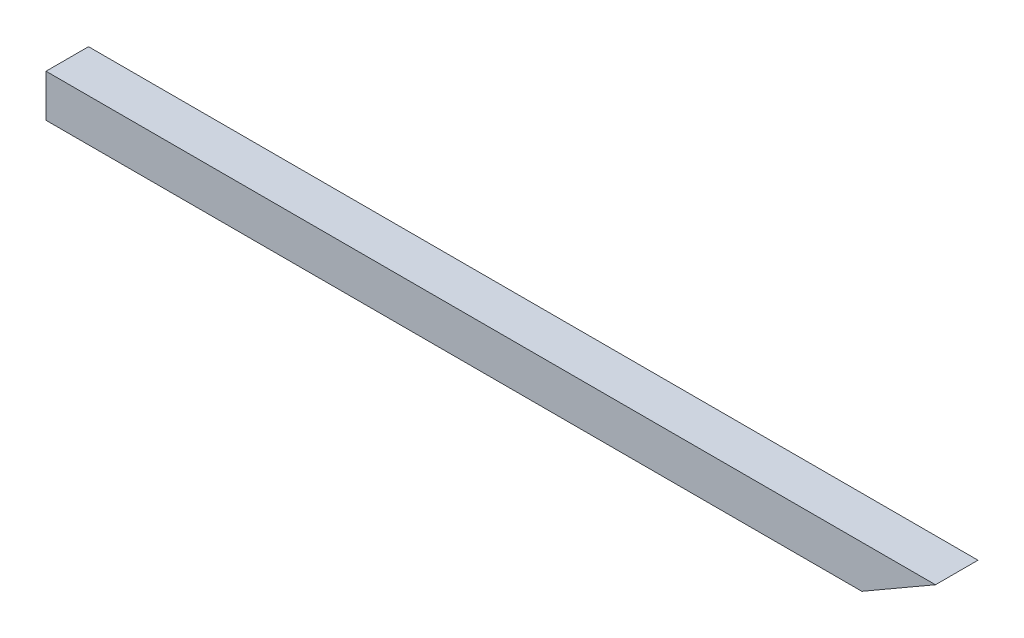
ISO-10303-21;
HEADER;
FILE_DESCRIPTION(('STEP AP214'),'2;1');
FILE_NAME('part.step','',(''),(''),'','','');
FILE_SCHEMA(('AUTOMOTIVE_DESIGN { 1 0 10303 214 1 1 1 1 }'));
ENDSEC;
DATA;
#1=APPLICATION_CONTEXT('core data for automotive mechanical design processes');
#2=APPLICATION_PROTOCOL_DEFINITION('international standard','automotive_design',2000,#1);
#3=PRODUCT_CONTEXT('',#1,'mechanical');
#4=PRODUCT('Part','Part','',(#3));
#5=PRODUCT_RELATED_PRODUCT_CATEGORY('part','',(#4));
#6=PRODUCT_DEFINITION_FORMATION('','',#4);
#7=PRODUCT_DEFINITION_CONTEXT('part definition',#1,'design');
#8=PRODUCT_DEFINITION('design','',#6,#7);
#9=PRODUCT_DEFINITION_SHAPE('','',#8);
#10=(LENGTH_UNIT() NAMED_UNIT(*) SI_UNIT(.MILLI.,.METRE.));
#11=(NAMED_UNIT(*) PLANE_ANGLE_UNIT() SI_UNIT($,.RADIAN.));
#12=(NAMED_UNIT(*) SI_UNIT($,.STERADIAN.) SOLID_ANGLE_UNIT());
#13=UNCERTAINTY_MEASURE_WITH_UNIT(LENGTH_MEASURE(1.E-05),#10,'distance_accuracy_value','');
#14=(GEOMETRIC_REPRESENTATION_CONTEXT(3) GLOBAL_UNCERTAINTY_ASSIGNED_CONTEXT((#13)) GLOBAL_UNIT_ASSIGNED_CONTEXT((#10,
#11,#12)) REPRESENTATION_CONTEXT('',''));
#15=CARTESIAN_POINT('',(0.,0.,0.));
#16=DIRECTION('',(0.,0.,1.));
#17=DIRECTION('',(1.,0.,0.));
#18=AXIS2_PLACEMENT_3D('',#15,#16,#17);
#19=CARTESIAN_POINT('',(-37.8688524590164,9.75409836065574,20.));
#20=DIRECTION('',(1.,0.,0.));
#21=DIRECTION('',(0.,1.,0.));
#22=AXIS2_PLACEMENT_3D('',#19,#20,#21);
#23=PLANE('',#22);
#24=DIRECTION('',(0.,-1.,0.));
#25=VECTOR('',#24,1.);
#26=CARTESIAN_POINT('',(-37.8688524590164,9.75409836065574,0.));
#27=LINE('',#26,#25);
#28=CARTESIAN_POINT('',(-37.8688524590164,9.75409836065574,0.));
#29=VERTEX_POINT('',#28);
#30=CARTESIAN_POINT('',(-37.8688524590165,-10.2459016393443,0.));
#31=VERTEX_POINT('',#30);
#32=EDGE_CURVE('E96',#29,#31,#27,.T.);
#33=ORIENTED_EDGE('',*,*,#32,.T.);
#34=DIRECTION('',(0.,0.,-1.));
#35=VECTOR('',#34,1.);
#36=CARTESIAN_POINT('',(-37.8688524590165,-10.2459016393443,20.));
#37=LINE('',#36,#35);
#38=CARTESIAN_POINT('',(-37.8688524590165,-10.2459016393443,20.));
#39=VERTEX_POINT('',#38);
#40=EDGE_CURVE('E11',#39,#31,#37,.T.);
#41=ORIENTED_EDGE('',*,*,#40,.F.);
#42=DIRECTION('',(0.,-1.,0.));
#43=VECTOR('',#42,1.);
#44=CARTESIAN_POINT('',(-37.8688524590164,9.75409836065574,20.));
#45=LINE('',#44,#43);
#46=CARTESIAN_POINT('',(-37.8688524590164,9.75409836065574,20.));
#47=VERTEX_POINT('',#46);
#48=EDGE_CURVE('E84',#47,#39,#45,.T.);
#49=ORIENTED_EDGE('',*,*,#48,.F.);
#50=DIRECTION('',(0.,0.,-1.));
#51=VECTOR('',#50,1.);
#52=CARTESIAN_POINT('',(-37.8688524590164,9.75409836065574,20.));
#53=LINE('',#52,#51);
#54=EDGE_CURVE('E92',#47,#29,#53,.T.);
#55=ORIENTED_EDGE('',*,*,#54,.T.);
#56=EDGE_LOOP('',(#33,#41,#49,#55));
#57=FACE_BOUND('',#56,.T.);
#58=ADVANCED_FACE('F33',(#57),#23,.F.);
#59=CARTESIAN_POINT('',(-37.8688524590165,-10.2459016393443,20.));
#60=DIRECTION('',(0.,1.,0.));
#61=DIRECTION('',(-1.,0.,0.));
#62=AXIS2_PLACEMENT_3D('',#59,#60,#61);
#63=PLANE('',#62);
#64=DIRECTION('',(1.,0.,0.));
#65=VECTOR('',#64,1.);
#66=CARTESIAN_POINT('',(-37.8688524590165,-10.2459016393443,0.));
#67=LINE('',#66,#65);
#68=CARTESIAN_POINT('',(345.911147540984,-10.2459016393443,0.));
#69=VERTEX_POINT('',#68);
#70=EDGE_CURVE('E88',#31,#69,#67,.T.);
#71=ORIENTED_EDGE('',*,*,#70,.T.);
#72=DIRECTION('',(0.,0.,-1.));
#73=VECTOR('',#72,1.);
#74=CARTESIAN_POINT('',(345.911147540984,-10.2459016393443,20.));
#75=LINE('',#74,#73);
#76=CARTESIAN_POINT('',(345.911147540984,-10.2459016393443,20.));
#77=VERTEX_POINT('',#76);
#78=EDGE_CURVE('E41',#77,#69,#75,.T.);
#79=ORIENTED_EDGE('',*,*,#78,.F.);
#80=DIRECTION('',(1.,0.,0.));
#81=VECTOR('',#80,1.);
#82=CARTESIAN_POINT('',(-37.8688524590165,-10.2459016393443,20.));
#83=LINE('',#82,#81);
#84=EDGE_CURVE('E79',#39,#77,#83,.T.);
#85=ORIENTED_EDGE('',*,*,#84,.F.);
#86=ORIENTED_EDGE('',*,*,#40,.T.);
#87=EDGE_LOOP('',(#71,#79,#85,#86));
#88=FACE_BOUND('',#87,.T.);
#89=ADVANCED_FACE('F87',(#88),#63,.F.);
#90=CARTESIAN_POINT('',(345.911147540984,-10.2459016393443,20.));
#91=DIRECTION('',(-0.5,0.866025403784438,0.));
#92=DIRECTION('',(-0.866025403784439,-0.5,0.));
#93=AXIS2_PLACEMENT_3D('',#90,#91,#92);
#94=PLANE('',#93);
#95=DIRECTION('',(0.866025403784439,0.5,0.));
#96=VECTOR('',#95,1.);
#97=CARTESIAN_POINT('',(345.911147540984,-10.2459016393443,0.));
#98=LINE('',#97,#96);
#99=CARTESIAN_POINT('',(380.552163692361,9.75409836065573,0.));
#100=VERTEX_POINT('',#99);
#101=EDGE_CURVE('E66',#69,#100,#98,.T.);
#102=ORIENTED_EDGE('',*,*,#101,.T.);
#103=DIRECTION('',(0.,0.,-1.));
#104=VECTOR('',#103,1.);
#105=CARTESIAN_POINT('',(380.552163692361,9.75409836065573,20.));
#106=LINE('',#105,#104);
#107=CARTESIAN_POINT('',(380.552163692361,9.75409836065573,20.));
#108=VERTEX_POINT('',#107);
#109=EDGE_CURVE('E89',#108,#100,#106,.T.);
#110=ORIENTED_EDGE('',*,*,#109,.F.);
#111=DIRECTION('',(0.866025403784439,0.5,0.));
#112=VECTOR('',#111,1.);
#113=CARTESIAN_POINT('',(345.911147540984,-10.2459016393443,20.));
#114=LINE('',#113,#112);
#115=EDGE_CURVE('E82',#77,#108,#114,.T.);
#116=ORIENTED_EDGE('',*,*,#115,.F.);
#117=ORIENTED_EDGE('',*,*,#78,.T.);
#118=EDGE_LOOP('',(#102,#110,#116,#117));
#119=FACE_BOUND('',#118,.T.);
#120=ADVANCED_FACE('F90',(#119),#94,.F.);
#121=CARTESIAN_POINT('',(-37.8688524590164,9.75409836065574,20.));
#122=DIRECTION('',(0.,-1.,0.));
#123=DIRECTION('',(1.,0.,0.));
#124=AXIS2_PLACEMENT_3D('',#121,#122,#123);
#125=PLANE('',#124);
#126=DIRECTION('',(-1.,0.,0.));
#127=VECTOR('',#126,1.);
#128=CARTESIAN_POINT('',(-37.8688524590164,9.75409836065574,0.));
#129=LINE('',#128,#127);
#130=EDGE_CURVE('E72',#100,#29,#129,.T.);
#131=ORIENTED_EDGE('',*,*,#130,.T.);
#132=ORIENTED_EDGE('',*,*,#54,.F.);
#133=DIRECTION('',(-1.,0.,0.));
#134=VECTOR('',#133,1.);
#135=CARTESIAN_POINT('',(-37.8688524590164,9.75409836065574,20.));
#136=LINE('',#135,#134);
#137=EDGE_CURVE('E49',#108,#47,#136,.T.);
#138=ORIENTED_EDGE('',*,*,#137,.F.);
#139=ORIENTED_EDGE('',*,*,#109,.T.);
#140=EDGE_LOOP('',(#131,#132,#138,#139));
#141=FACE_BOUND('',#140,.T.);
#142=ADVANCED_FACE('F103',(#141),#125,.F.);
#143=CARTESIAN_POINT('',(0.,0.,20.));
#144=DIRECTION('',(0.,0.,1.));
#145=DIRECTION('',(1.,0.,0.));
#146=AXIS2_PLACEMENT_3D('',#143,#144,#145);
#147=PLANE('',#146);
#148=ORIENTED_EDGE('',*,*,#48,.T.);
#149=ORIENTED_EDGE('',*,*,#84,.T.);
#150=ORIENTED_EDGE('',*,*,#115,.T.);
#151=ORIENTED_EDGE('',*,*,#137,.T.);
#152=EDGE_LOOP('',(#148,#149,#150,#151));
#153=FACE_BOUND('',#152,.T.);
#154=ADVANCED_FACE('F80',(#153),#147,.T.);
#155=CARTESIAN_POINT('',(0.,0.,0.));
#156=DIRECTION('',(0.,0.,1.));
#157=DIRECTION('',(1.,0.,0.));
#158=AXIS2_PLACEMENT_3D('',#155,#156,#157);
#159=PLANE('',#158);
#160=ORIENTED_EDGE('',*,*,#32,.F.);
#161=ORIENTED_EDGE('',*,*,#130,.F.);
#162=ORIENTED_EDGE('',*,*,#101,.F.);
#163=ORIENTED_EDGE('',*,*,#70,.F.);
#164=EDGE_LOOP('',(#160,#161,#162,#163));
#165=FACE_BOUND('',#164,.T.);
#166=ADVANCED_FACE('F106',(#165),#159,.F.);
#167=CLOSED_SHELL('',(#58,#89,#120,#142,#154,#166));
#168=MANIFOLD_SOLID_BREP('B2',#167);
#169=ADVANCED_BREP_SHAPE_REPRESENTATION('',(#18,#168),#14);
#170=SHAPE_DEFINITION_REPRESENTATION(#9,#169);
ENDSEC;
END-ISO-10303-21;
